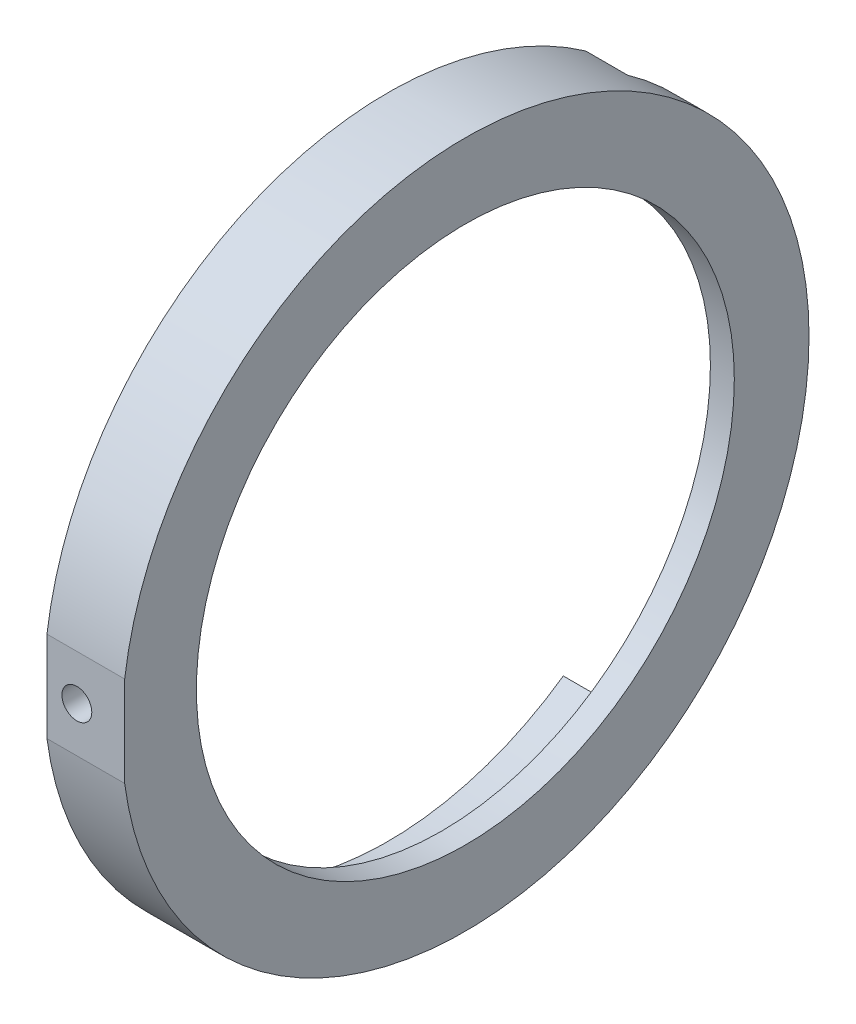
ISO-10303-21;
HEADER;
FILE_DESCRIPTION(('STEP AP214'),'2;1');
FILE_NAME('part.step','',(''),(''),'','','');
FILE_SCHEMA(('AUTOMOTIVE_DESIGN { 1 0 10303 214 1 1 1 1 }'));
ENDSEC;
DATA;
#1=APPLICATION_CONTEXT('core data for automotive mechanical design processes');
#2=APPLICATION_PROTOCOL_DEFINITION('international standard','automotive_design',2000,#1);
#3=PRODUCT_CONTEXT('',#1,'mechanical');
#4=PRODUCT('Part','Part','',(#3));
#5=PRODUCT_RELATED_PRODUCT_CATEGORY('part','',(#4));
#6=PRODUCT_DEFINITION_FORMATION('','',#4);
#7=PRODUCT_DEFINITION_CONTEXT('part definition',#1,'design');
#8=PRODUCT_DEFINITION('design','',#6,#7);
#9=PRODUCT_DEFINITION_SHAPE('','',#8);
#10=(LENGTH_UNIT() NAMED_UNIT(*) SI_UNIT(.MILLI.,.METRE.));
#11=(NAMED_UNIT(*) PLANE_ANGLE_UNIT() SI_UNIT($,.RADIAN.));
#12=(NAMED_UNIT(*) SI_UNIT($,.STERADIAN.) SOLID_ANGLE_UNIT());
#13=UNCERTAINTY_MEASURE_WITH_UNIT(LENGTH_MEASURE(1.E-05),#10,'distance_accuracy_value','');
#14=(GEOMETRIC_REPRESENTATION_CONTEXT(3) GLOBAL_UNCERTAINTY_ASSIGNED_CONTEXT((#13)) GLOBAL_UNIT_ASSIGNED_CONTEXT((#10,
#11,#12)) REPRESENTATION_CONTEXT('',''));
#15=CARTESIAN_POINT('',(0.,0.,0.));
#16=DIRECTION('',(0.,0.,1.));
#17=DIRECTION('',(1.,0.,0.));
#18=AXIS2_PLACEMENT_3D('',#15,#16,#17);
#19=CARTESIAN_POINT('',(-7.001,0.,0.));
#20=DIRECTION('',(1.,0.,0.));
#21=DIRECTION('',(0.,0.,-1.));
#22=AXIS2_PLACEMENT_3D('',#19,#20,#21);
#23=CYLINDRICAL_SURFACE('',#22,45.);
#24=CARTESIAN_POINT('',(6.,0.,0.));
#25=DIRECTION('',(1.,0.,0.));
#26=DIRECTION('',(0.,0.,-1.));
#27=AXIS2_PLACEMENT_3D('',#24,#25,#26);
#28=CIRCLE('',#27,45.);
#29=CARTESIAN_POINT('',(6.,0.,-45.));
#30=VERTEX_POINT('',#29);
#31=EDGE_CURVE('E183',#30,#30,#28,.T.);
#32=ORIENTED_EDGE('',*,*,#31,.T.);
#33=EDGE_LOOP('',(#32));
#34=FACE_BOUND('',#33,.T.);
#35=CARTESIAN_POINT('',(2.,0.,0.));
#36=DIRECTION('',(-1.,0.,0.));
#37=DIRECTION('',(0.,0.,1.));
#38=AXIS2_PLACEMENT_3D('',#35,#36,#37);
#39=CIRCLE('',#38,45.);
#40=CARTESIAN_POINT('',(2.,0.,45.));
#41=VERTEX_POINT('',#40);
#42=EDGE_CURVE('E54',#41,#41,#39,.F.);
#43=ORIENTED_EDGE('',*,*,#42,.F.);
#44=EDGE_LOOP('',(#43));
#45=FACE_BOUND('',#44,.T.);
#46=ADVANCED_FACE('F50',(#34,#45),#23,.F.);
#47=CARTESIAN_POINT('',(0.,0.,0.));
#48=DIRECTION('',(1.,0.,0.));
#49=DIRECTION('',(0.,0.,-1.));
#50=AXIS2_PLACEMENT_3D('',#47,#48,#49);
#51=PLANE('',#50);
#52=DIRECTION('',(0.,0.817391304347826,0.576082854784413));
#53=VECTOR('',#52,1.);
#54=CARTESIAN_POINT('',(0.,0.,0.));
#55=LINE('',#54,#53);
#56=CARTESIAN_POINT('',(0.,-47.,-33.1247641501038));
#57=VERTEX_POINT('',#56);
#58=CARTESIAN_POINT('',(0.,-41.6869565217391,-29.3802255940051));
#59=VERTEX_POINT('',#58);
#60=EDGE_CURVE('E109',#57,#59,#55,.T.);
#61=ORIENTED_EDGE('',*,*,#60,.T.);
#62=CARTESIAN_POINT('',(0.,0.,0.));
#63=DIRECTION('',(-1.,0.,0.));
#64=DIRECTION('',(0.,0.,1.));
#65=AXIS2_PLACEMENT_3D('',#62,#63,#64);
#66=CIRCLE('',#65,51.);
#67=CARTESIAN_POINT('',(0.,41.6869565217391,-29.3802255940051));
#68=VERTEX_POINT('',#67);
#69=EDGE_CURVE('E101',#68,#59,#66,.T.);
#70=ORIENTED_EDGE('',*,*,#69,.F.);
#71=DIRECTION('',(0.,-0.817391304347826,0.576082854784413));
#72=VECTOR('',#71,1.);
#73=CARTESIAN_POINT('',(0.,0.,0.));
#74=LINE('',#73,#72);
#75=CARTESIAN_POINT('',(0.,47.,-33.1247641501038));
#76=VERTEX_POINT('',#75);
#77=EDGE_CURVE('E106',#76,#68,#74,.T.);
#78=ORIENTED_EDGE('',*,*,#77,.F.);
#79=CARTESIAN_POINT('',(0.,0.,0.));
#80=DIRECTION('',(1.,0.,0.));
#81=DIRECTION('',(0.,0.,-1.));
#82=AXIS2_PLACEMENT_3D('',#79,#80,#81);
#83=CIRCLE('',#82,57.5);
#84=EDGE_CURVE('E140',#57,#76,#83,.T.);
#85=ORIENTED_EDGE('',*,*,#84,.F.);
#86=EDGE_LOOP('',(#61,#70,#78,#85));
#87=FACE_BOUND('',#86,.T.);
#88=ADVANCED_FACE('F103',(#87),#51,.F.);
#89=CARTESIAN_POINT('',(6.,0.,0.));
#90=DIRECTION('',(-1.,0.,0.));
#91=DIRECTION('',(0.,0.,1.));
#92=AXIS2_PLACEMENT_3D('',#89,#90,#91);
#93=CYLINDRICAL_SURFACE('',#92,57.5);
#94=DIRECTION('',(-1.,0.,0.));
#95=VECTOR('',#94,1.);
#96=CARTESIAN_POINT('',(6.,-7.56637297521074,57.));
#97=LINE('',#96,#95);
#98=CARTESIAN_POINT('',(6.,-7.56637297521074,57.));
#99=VERTEX_POINT('',#98);
#100=CARTESIAN_POINT('',(-7.,-7.56637297521074,57.));
#101=VERTEX_POINT('',#100);
#102=EDGE_CURVE('E144',#99,#101,#97,.T.);
#103=ORIENTED_EDGE('',*,*,#102,.T.);
#104=CARTESIAN_POINT('',(-7.,0.,0.));
#105=DIRECTION('',(-1.,0.,0.));
#106=DIRECTION('',(0.,0.,1.));
#107=AXIS2_PLACEMENT_3D('',#104,#105,#106);
#108=CIRCLE('',#107,57.5);
#109=CARTESIAN_POINT('',(-7.,-47.,-33.1247641501038));
#110=VERTEX_POINT('',#109);
#111=EDGE_CURVE('E197',#110,#101,#108,.T.);
#112=ORIENTED_EDGE('',*,*,#111,.F.);
#113=DIRECTION('',(1.,0.,0.));
#114=VECTOR('',#113,1.);
#115=CARTESIAN_POINT('',(-7.,-47.,-33.1247641501038));
#116=LINE('',#115,#114);
#117=EDGE_CURVE('E136',#110,#57,#116,.T.);
#118=ORIENTED_EDGE('',*,*,#117,.T.);
#119=ORIENTED_EDGE('',*,*,#84,.T.);
#120=DIRECTION('',(1.,0.,0.));
#121=VECTOR('',#120,1.);
#122=CARTESIAN_POINT('',(-7.,47.,-33.1247641501038));
#123=LINE('',#122,#121);
#124=CARTESIAN_POINT('',(-7.,47.,-33.1247641501038));
#125=VERTEX_POINT('',#124);
#126=EDGE_CURVE('E123',#125,#76,#123,.T.);
#127=ORIENTED_EDGE('',*,*,#126,.F.);
#128=CARTESIAN_POINT('',(-7.,7.56637297521074,57.));
#129=VERTEX_POINT('',#128);
#130=EDGE_CURVE('E201',#129,#125,#108,.T.);
#131=ORIENTED_EDGE('',*,*,#130,.F.);
#132=DIRECTION('',(-1.,0.,0.));
#133=VECTOR('',#132,1.);
#134=CARTESIAN_POINT('',(6.,7.56637297521074,57.));
#135=LINE('',#134,#133);
#136=CARTESIAN_POINT('',(6.,7.56637297521074,57.));
#137=VERTEX_POINT('',#136);
#138=EDGE_CURVE('E59',#137,#129,#135,.T.);
#139=ORIENTED_EDGE('',*,*,#138,.F.);
#140=CARTESIAN_POINT('',(6.,0.,0.));
#141=DIRECTION('',(1.,0.,0.));
#142=DIRECTION('',(0.,0.,-1.));
#143=AXIS2_PLACEMENT_3D('',#140,#141,#142);
#144=CIRCLE('',#143,57.5);
#145=EDGE_CURVE('E141',#99,#137,#144,.T.);
#146=ORIENTED_EDGE('',*,*,#145,.F.);
#147=EDGE_LOOP('',(#103,#112,#118,#119,#127,#131,#139,#146));
#148=FACE_BOUND('',#147,.T.);
#149=ADVANCED_FACE('F52',(#148),#93,.T.);
#150=CARTESIAN_POINT('',(6.,7.56637297521074,57.));
#151=DIRECTION('',(0.,0.,-1.));
#152=DIRECTION('',(-1.,0.,0.));
#153=AXIS2_PLACEMENT_3D('',#150,#151,#152);
#154=PLANE('',#153);
#155=CARTESIAN_POINT('',(-2.,0.,57.));
#156=DIRECTION('',(0.,0.,1.));
#157=DIRECTION('',(1.,0.,0.));
#158=AXIS2_PLACEMENT_3D('',#155,#156,#157);
#159=CIRCLE('',#158,2.5);
#160=CARTESIAN_POINT('',(0.499999999999999,0.,57.));
#161=VERTEX_POINT('',#160);
#162=EDGE_CURVE('E131',#161,#161,#159,.T.);
#163=ORIENTED_EDGE('',*,*,#162,.F.);
#164=EDGE_LOOP('',(#163));
#165=FACE_BOUND('',#164,.T.);
#166=ORIENTED_EDGE('',*,*,#138,.T.);
#167=DIRECTION('',(0.,1.,0.));
#168=VECTOR('',#167,1.);
#169=CARTESIAN_POINT('',(-7.,0.,57.));
#170=LINE('',#169,#168);
#171=EDGE_CURVE('E200',#101,#129,#170,.T.);
#172=ORIENTED_EDGE('',*,*,#171,.F.);
#173=ORIENTED_EDGE('',*,*,#102,.F.);
#174=DIRECTION('',(0.,-1.,0.));
#175=VECTOR('',#174,1.);
#176=CARTESIAN_POINT('',(6.,7.56637297521074,57.));
#177=LINE('',#176,#175);
#178=EDGE_CURVE('E65',#137,#99,#177,.T.);
#179=ORIENTED_EDGE('',*,*,#178,.F.);
#180=EDGE_LOOP('',(#166,#172,#173,#179));
#181=FACE_BOUND('',#180,.T.);
#182=ADVANCED_FACE('F209',(#165,#181),#154,.F.);
#183=CARTESIAN_POINT('',(6.,0.,0.));
#184=DIRECTION('',(1.,0.,0.));
#185=DIRECTION('',(0.,0.,-1.));
#186=AXIS2_PLACEMENT_3D('',#183,#184,#185);
#187=PLANE('',#186);
#188=ORIENTED_EDGE('',*,*,#31,.F.);
#189=EDGE_LOOP('',(#188));
#190=FACE_BOUND('',#189,.T.);
#191=ORIENTED_EDGE('',*,*,#145,.T.);
#192=ORIENTED_EDGE('',*,*,#178,.T.);
#193=EDGE_LOOP('',(#191,#192));
#194=FACE_BOUND('',#193,.T.);
#195=ADVANCED_FACE('F173',(#190,#194),#187,.T.);
#196=CARTESIAN_POINT('',(-7.,0.,0.));
#197=DIRECTION('',(1.,0.,0.));
#198=DIRECTION('',(0.,0.,-1.));
#199=AXIS2_PLACEMENT_3D('',#196,#197,#198);
#200=CYLINDRICAL_SURFACE('',#199,51.);
#201=DIRECTION('',(1.,0.,0.));
#202=VECTOR('',#201,1.);
#203=CARTESIAN_POINT('',(-7.,41.6869565217391,-29.3802255940051));
#204=LINE('',#203,#202);
#205=CARTESIAN_POINT('',(-7.,41.6869565217391,-29.3802255940051));
#206=VERTEX_POINT('',#205);
#207=EDGE_CURVE('E116',#206,#68,#204,.T.);
#208=ORIENTED_EDGE('',*,*,#207,.T.);
#209=ORIENTED_EDGE('',*,*,#69,.T.);
#210=DIRECTION('',(1.,0.,0.));
#211=VECTOR('',#210,1.);
#212=CARTESIAN_POINT('',(-7.,-41.6869565217391,-29.3802255940051));
#213=LINE('',#212,#211);
#214=CARTESIAN_POINT('',(-7.,-41.6869565217391,-29.3802255940051));
#215=VERTEX_POINT('',#214);
#216=EDGE_CURVE('E138',#215,#59,#213,.T.);
#217=ORIENTED_EDGE('',*,*,#216,.F.);
#218=CARTESIAN_POINT('',(-7.,0.,0.));
#219=DIRECTION('',(-1.,0.,0.));
#220=DIRECTION('',(0.,0.,1.));
#221=AXIS2_PLACEMENT_3D('',#218,#219,#220);
#222=CIRCLE('',#221,51.);
#223=EDGE_CURVE('E120',#215,#206,#222,.T.);
#224=ORIENTED_EDGE('',*,*,#223,.T.);
#225=EDGE_LOOP('',(#208,#209,#217,#224));
#226=FACE_BOUND('',#225,.T.);
#227=CARTESIAN_POINT('',(0.,-1.5,50.9779364038993));
#228=CARTESIAN_POINT('',(-0.0843135782892655,-1.61241156453926,50.9746287163455));
#229=CARTESIAN_POINT('',(-0.178152769601,-1.71773557867447,50.9711556701492));
#230=CARTESIAN_POINT('',(-0.382224278352684,-1.9111752728383,50.9642699979308));
#231=CARTESIAN_POINT('',(-0.492466237310853,-1.99928076090283,50.9608574087745));
#232=CARTESIAN_POINT('',(-0.726170751623759,-2.15571861377558,50.9544799070043));
#233=CARTESIAN_POINT('',(-0.84963051028838,-2.22405515011677,50.9515149000074));
#234=CARTESIAN_POINT('',(-1.10627043847989,-2.33902046493766,50.9463670256596));
#235=CARTESIAN_POINT('',(-1.2394494196134,-2.38565189222758,50.9441840628785));
#236=CARTESIAN_POINT('',(-1.51168780221796,-2.45587077811503,50.9408475081081));
#237=CARTESIAN_POINT('',(-1.65074405925345,-2.47947040026714,50.9396933728025));
#238=CARTESIAN_POINT('',(-1.93085155948115,-2.50299262254998,50.9385430777048));
#239=CARTESIAN_POINT('',(-2.07190282410479,-2.50291496813333,50.9385469303618));
#240=CARTESIAN_POINT('',(-2.3518533117359,-2.47909574588257,50.9397116396288));
#241=CARTESIAN_POINT('',(-2.49075443833553,-2.45537648875403,50.9408714053974));
#242=CARTESIAN_POINT('',(-2.76260041334267,-2.38498523489592,50.9442153267204));
#243=CARTESIAN_POINT('',(-2.89554524905529,-2.3383131892486,50.9463994844579));
#244=CARTESIAN_POINT('',(-3.15175402521818,-2.22332748967061,50.9515466886888));
#245=CARTESIAN_POINT('',(-3.27501492413907,-2.15500707006432,50.9545099786316));
#246=CARTESIAN_POINT('',(-3.50832517548084,-1.99866815675006,50.960881313019));
#247=CARTESIAN_POINT('',(-3.61837444715708,-1.91064954266331,50.9642893601815));
#248=CARTESIAN_POINT('',(-3.82226196502165,-1.71730044341477,50.9711705095718));
#249=CARTESIAN_POINT('',(-3.91608271414029,-1.61195150900644,50.9746436775956));
#250=CARTESIAN_POINT('',(-4.08471035998926,-1.38699076752993,50.9812602477405));
#251=CARTESIAN_POINT('',(-4.15951722570315,-1.26737893719583,50.9844036493238));
#252=CARTESIAN_POINT('',(-4.28800181222243,-1.01725985432581,50.9900069917112));
#253=CARTESIAN_POINT('',(-4.34167616425352,-0.886750868669538,50.9924668235278));
#254=CARTESIAN_POINT('',(-4.42634668467609,-0.618559103425852,50.9964249338146));
#255=CARTESIAN_POINT('',(-4.45734301591323,-0.480876375359035,50.9979232191894));
#256=CARTESIAN_POINT('',(-4.49575132359914,-0.202392593268039,50.9997882431188));
#257=CARTESIAN_POINT('',(-4.50318683206406,-0.0615947921734995,51.0001561106978));
#258=CARTESIAN_POINT('',(-4.49432703444818,0.219249966585605,50.9997220502392));
#259=CARTESIAN_POINT('',(-4.47803181644826,0.359296927035114,50.9989201265434));
#260=CARTESIAN_POINT('',(-4.42219393537119,0.634578109366438,50.9962376624771));
#261=CARTESIAN_POINT('',(-4.38266518344437,0.769815159853576,50.9943577675616));
#262=CARTESIAN_POINT('',(-4.28149830156677,1.03173389168264,50.9897312905797));
#263=CARTESIAN_POINT('',(-4.21986007352641,1.15841553506519,50.9869847046683));
#264=CARTESIAN_POINT('',(-4.0761717439762,1.39973040167773,50.9809312758243));
#265=CARTESIAN_POINT('',(-3.99410669231956,1.51435471249092,50.9776240231145));
#266=CARTESIAN_POINT('',(-3.81191272386398,1.72820850256561,50.9708226732869));
#267=CARTESIAN_POINT('',(-3.711783671961,1.82743786667509,50.9673285747718));
#268=CARTESIAN_POINT('',(-3.49619317759137,2.00777849608133,50.9605435481227));
#269=CARTESIAN_POINT('',(-3.38071766467502,2.08887294905681,50.9572528105465));
#270=CARTESIAN_POINT('',(-3.13777678035147,2.23052350535342,50.9512493582636));
#271=CARTESIAN_POINT('',(-3.01031143696975,2.29107965668002,50.9485366422057));
#272=CARTESIAN_POINT('',(-2.74704866306239,2.38991227675522,50.9439965214623));
#273=CARTESIAN_POINT('',(-2.611253905945,2.42819585317292,50.9421688343758));
#274=CARTESIAN_POINT('',(-2.33515667447098,2.48141788044272,50.9396042804654));
#275=CARTESIAN_POINT('',(-2.19485430818088,2.49635689053764,50.9388673875105));
#276=CARTESIAN_POINT('',(-1.91389032080008,2.50246043247716,50.9385679226166));
#277=CARTESIAN_POINT('',(-1.77322927805302,2.49365157239858,50.9390040363921));
#278=CARTESIAN_POINT('',(-1.49536790577487,2.45256414473121,50.9409986633082));
#279=CARTESIAN_POINT('',(-1.3581679799114,2.4202828525435,50.9425573067479));
#280=CARTESIAN_POINT('',(-1.09113166658499,2.33317151399501,50.9466210763501));
#281=CARTESIAN_POINT('',(-0.961295989524965,2.27833929642205,50.9491262936471));
#282=CARTESIAN_POINT('',(-0.712727688091228,2.14770116517376,50.9547998620447));
#283=CARTESIAN_POINT('',(-0.593988613824364,2.07190753803205,50.957967824413));
#284=CARTESIAN_POINT('',(-0.391397754999653,1.91717234997679,50.9639998425617));
#285=CARTESIAN_POINT('',(-0.305139892550743,1.84135174018829,50.9668132377625));
#286=CARTESIAN_POINT('',(-0.143822264544156,1.6786099411736,50.9724327363288));
#287=CARTESIAN_POINT('',(-0.0687625208007094,1.59168873032378,50.9752388396801));
#288=CARTESIAN_POINT('',(0.0842477847585784,1.38766304191359,50.9812414573945));
#289=CARTESIAN_POINT('',(0.159042725952921,1.2681694981089,50.9843835813815));
#290=CARTESIAN_POINT('',(0.287553540679155,1.01826476966428,50.989986818031));
#291=CARTESIAN_POINT('',(0.341257321848745,0.887847373798193,50.9924475397819));
#292=CARTESIAN_POINT('',(0.426007408306444,0.619861814300473,50.9964087780204));
#293=CARTESIAN_POINT('',(0.457059226763648,0.482295399376987,50.9979095281407));
#294=CARTESIAN_POINT('',(0.495631223447488,0.203895029286802,50.9997823217034));
#295=CARTESIAN_POINT('',(0.503151543805921,0.0630610938613197,51.0001543719634));
#296=CARTESIAN_POINT('',(0.494453465277316,-0.217800143227139,50.9997282545587));
#297=CARTESIAN_POINT('',(0.478245751071758,-0.357827779464742,50.9989306136032));
#298=CARTESIAN_POINT('',(0.422574144847607,-0.633113372552026,50.9962557220827));
#299=CARTESIAN_POINT('',(0.383123438895966,-0.768373987723479,50.9943790836624));
#300=CARTESIAN_POINT('',(0.291337132000945,-1.00646739392636,50.9901809460457));
#301=CARTESIAN_POINT('',(0.242646960336522,-1.11072561016047,50.9880023088781));
#302=CARTESIAN_POINT('',(0.13142445047305,-1.31156654668991,50.9832313833204));
#303=CARTESIAN_POINT('',(0.0688920735962792,-1.40814924553738,50.9806390937746));
#304=CARTESIAN_POINT('',(0.,-1.5,50.9779364038993));
#305=B_SPLINE_CURVE_WITH_KNOTS('',3,(#227,#228,#229,#230,#231,#232,#233,#234,#235,#236,#237,
#238,#239,#240,#241,#242,#243,#244,#245,#246,#247,#248,#249,#250,#251,#252,#253,#254,#255,#256,
#257,#258,#259,#260,#261,#262,#263,#264,#265,#266,#267,#268,#269,#270,#271,#272,#273,#274,#275,
#276,#277,#278,#279,#280,#281,#282,#283,#284,#285,#286,#287,#288,#289,#290,#291,#292,#293,#294,
#295,#296,#297,#298,#299,#300,#301,#302,#303,#304),.UNSPECIFIED.,.T.,.F.,(4,2,2,2,2,2,2,2,2,2,2,
2,2,2,2,2,2,2,2,2,2,2,2,2,2,2,2,2,2,2,2,2,2,2,2,2,2,2,4),(0.,0.421257066748204,
0.842762733098955,1.26417939070874,1.6855446067154,2.10668717075197,2.52783426236724,
2.94858429118349,3.36933521671982,3.79021776769013,4.21110289081024,4.6324390078724,
5.05377581223554,5.47517975553362,5.89658067279729,6.31756057148871,6.7385389076409,
7.15926543811796,7.57999383518833,8.00103106842656,8.42207145081183,8.8435005634322,
9.26492869101272,9.68622225772297,10.1075057317626,10.5283173789461,10.9491778802929,
11.370078911748,11.7907337529835,12.1343185629616,12.4779040422432,12.8988646930108,
13.3200663453731,13.741165448944,14.1622620090436,14.5831690086072,15.0038374514941,
15.34804288486,15.6922492800127),.UNSPECIFIED.);
#306=CARTESIAN_POINT('',(0.,-1.5,50.9779364038993));
#307=VERTEX_POINT('',#306);
#308=EDGE_CURVE('E14',#307,#307,#305,.T.);
#309=ORIENTED_EDGE('',*,*,#308,.F.);
#310=EDGE_LOOP('',(#309));
#311=FACE_BOUND('',#310,.T.);
#312=CARTESIAN_POINT('',(2.,0.,0.));
#313=DIRECTION('',(-1.,0.,0.));
#314=DIRECTION('',(0.,0.,1.));
#315=AXIS2_PLACEMENT_3D('',#312,#313,#314);
#316=CIRCLE('',#315,51.);
#317=CARTESIAN_POINT('',(2.,0.,51.));
#318=VERTEX_POINT('',#317);
#319=EDGE_CURVE('E112',#318,#318,#316,.T.);
#320=ORIENTED_EDGE('',*,*,#319,.F.);
#321=EDGE_LOOP('',(#320));
#322=FACE_BOUND('',#321,.T.);
#323=ADVANCED_FACE('F117',(#226,#311,#322),#200,.F.);
#324=CARTESIAN_POINT('',(-7.,0.,0.));
#325=DIRECTION('',(0.,0.576082854784413,-0.817391304347826));
#326=DIRECTION('',(0.,0.817391304347826,0.576082854784413));
#327=AXIS2_PLACEMENT_3D('',#324,#325,#326);
#328=PLANE('',#327);
#329=ORIENTED_EDGE('',*,*,#60,.F.);
#330=ORIENTED_EDGE('',*,*,#117,.F.);
#331=DIRECTION('',(0.,0.817391304347826,0.576082854784413));
#332=VECTOR('',#331,1.);
#333=CARTESIAN_POINT('',(-7.,0.,0.));
#334=LINE('',#333,#332);
#335=EDGE_CURVE('E129',#110,#215,#334,.T.);
#336=ORIENTED_EDGE('',*,*,#335,.T.);
#337=ORIENTED_EDGE('',*,*,#216,.T.);
#338=EDGE_LOOP('',(#329,#330,#336,#337));
#339=FACE_BOUND('',#338,.T.);
#340=ADVANCED_FACE('F167',(#339),#328,.T.);
#341=CARTESIAN_POINT('',(-7.,0.,0.));
#342=DIRECTION('',(0.,0.576082854784413,0.817391304347826));
#343=DIRECTION('',(0.,-0.817391304347826,0.576082854784413));
#344=AXIS2_PLACEMENT_3D('',#341,#342,#343);
#345=PLANE('',#344);
#346=ORIENTED_EDGE('',*,*,#77,.T.);
#347=ORIENTED_EDGE('',*,*,#207,.F.);
#348=DIRECTION('',(0.,-0.817391304347826,0.576082854784413));
#349=VECTOR('',#348,1.);
#350=CARTESIAN_POINT('',(-7.,0.,0.));
#351=LINE('',#350,#349);
#352=EDGE_CURVE('E124',#125,#206,#351,.T.);
#353=ORIENTED_EDGE('',*,*,#352,.F.);
#354=ORIENTED_EDGE('',*,*,#126,.T.);
#355=EDGE_LOOP('',(#346,#347,#353,#354));
#356=FACE_BOUND('',#355,.T.);
#357=ADVANCED_FACE('F126',(#356),#345,.F.);
#358=CARTESIAN_POINT('',(-7.,0.,0.));
#359=DIRECTION('',(-1.,0.,0.));
#360=DIRECTION('',(0.,0.,1.));
#361=AXIS2_PLACEMENT_3D('',#358,#359,#360);
#362=PLANE('',#361);
#363=ORIENTED_EDGE('',*,*,#223,.F.);
#364=ORIENTED_EDGE('',*,*,#335,.F.);
#365=ORIENTED_EDGE('',*,*,#111,.T.);
#366=ORIENTED_EDGE('',*,*,#171,.T.);
#367=ORIENTED_EDGE('',*,*,#130,.T.);
#368=ORIENTED_EDGE('',*,*,#352,.T.);
#369=EDGE_LOOP('',(#363,#364,#365,#366,#367,#368));
#370=FACE_BOUND('',#369,.T.);
#371=ADVANCED_FACE('F160',(#370),#362,.T.);
#372=CARTESIAN_POINT('',(-2.,0.,50.));
#373=DIRECTION('',(0.,0.,1.));
#374=DIRECTION('',(1.,0.,0.));
#375=AXIS2_PLACEMENT_3D('',#372,#373,#374);
#376=CYLINDRICAL_SURFACE('',#375,2.5);
#377=ORIENTED_EDGE('',*,*,#162,.T.);
#378=EDGE_LOOP('',(#377));
#379=FACE_BOUND('',#378,.T.);
#380=ORIENTED_EDGE('',*,*,#308,.T.);
#381=EDGE_LOOP('',(#380));
#382=FACE_BOUND('',#381,.T.);
#383=ADVANCED_FACE('F154',(#379,#382),#376,.F.);
#384=CARTESIAN_POINT('',(2.,0.,0.));
#385=DIRECTION('',(-1.,0.,0.));
#386=DIRECTION('',(0.,0.,1.));
#387=AXIS2_PLACEMENT_3D('',#384,#385,#386);
#388=PLANE('',#387);
#389=ORIENTED_EDGE('',*,*,#319,.T.);
#390=EDGE_LOOP('',(#389));
#391=FACE_BOUND('',#390,.T.);
#392=ORIENTED_EDGE('',*,*,#42,.T.);
#393=EDGE_LOOP('',(#392));
#394=FACE_BOUND('',#393,.T.);
#395=ADVANCED_FACE('F159',(#391,#394),#388,.T.);
#396=CLOSED_SHELL('',(#46,#88,#149,#182,#195,#323,#340,#357,#371,#383,#395));
#397=MANIFOLD_SOLID_BREP('B2',#396);
#398=ADVANCED_BREP_SHAPE_REPRESENTATION('',(#18,#397),#14);
#399=SHAPE_DEFINITION_REPRESENTATION(#9,#398);
ENDSEC;
END-ISO-10303-21;
